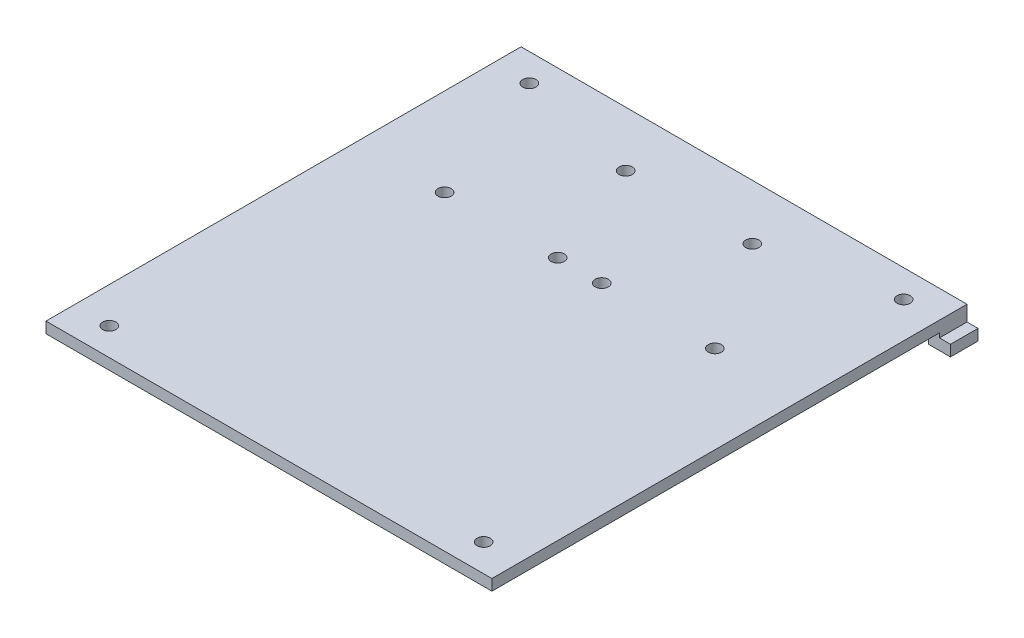
ISO-10303-21;
HEADER;
FILE_DESCRIPTION(('STEP AP214'),'2;1');
FILE_NAME('part.step','',(''),(''),'','','');
FILE_SCHEMA(('AUTOMOTIVE_DESIGN { 1 0 10303 214 1 1 1 1 }'));
ENDSEC;
DATA;
#1=APPLICATION_CONTEXT('core data for automotive mechanical design processes');
#2=APPLICATION_PROTOCOL_DEFINITION('international standard','automotive_design',2000,#1);
#3=PRODUCT_CONTEXT('',#1,'mechanical');
#4=PRODUCT('Part','Part','',(#3));
#5=PRODUCT_RELATED_PRODUCT_CATEGORY('part','',(#4));
#6=PRODUCT_DEFINITION_FORMATION('','',#4);
#7=PRODUCT_DEFINITION_CONTEXT('part definition',#1,'design');
#8=PRODUCT_DEFINITION('design','',#6,#7);
#9=PRODUCT_DEFINITION_SHAPE('','',#8);
#10=(LENGTH_UNIT() NAMED_UNIT(*) SI_UNIT(.MILLI.,.METRE.));
#11=(NAMED_UNIT(*) PLANE_ANGLE_UNIT() SI_UNIT($,.RADIAN.));
#12=(NAMED_UNIT(*) SI_UNIT($,.STERADIAN.) SOLID_ANGLE_UNIT());
#13=UNCERTAINTY_MEASURE_WITH_UNIT(LENGTH_MEASURE(1.E-05),#10,'distance_accuracy_value','');
#14=(GEOMETRIC_REPRESENTATION_CONTEXT(3) GLOBAL_UNCERTAINTY_ASSIGNED_CONTEXT((#13)) GLOBAL_UNIT_ASSIGNED_CONTEXT((#10,
#11,#12)) REPRESENTATION_CONTEXT('',''));
#15=CARTESIAN_POINT('',(0.,0.,0.));
#16=DIRECTION('',(0.,0.,1.));
#17=DIRECTION('',(1.,0.,0.));
#18=AXIS2_PLACEMENT_3D('',#15,#16,#17);
#19=CARTESIAN_POINT('',(0.,0.,0.));
#20=DIRECTION('',(0.,1.,0.));
#21=DIRECTION('',(0.,0.,1.));
#22=AXIS2_PLACEMENT_3D('',#19,#20,#21);
#23=PLANE('',#22);
#24=CARTESIAN_POINT('',(24.55,0.,-13.3));
#25=DIRECTION('',(0.,1.,0.));
#26=DIRECTION('',(0.,0.,1.));
#27=AXIS2_PLACEMENT_3D('',#24,#25,#26);
#28=CIRCLE('',#27,1.2);
#29=CARTESIAN_POINT('',(24.55,0.,-12.1));
#30=VERTEX_POINT('',#29);
#31=EDGE_CURVE('E237',#30,#30,#28,.T.);
#32=ORIENTED_EDGE('',*,*,#31,.T.);
#33=EDGE_LOOP('',(#32));
#34=FACE_BOUND('',#33,.T.);
#35=CARTESIAN_POINT('',(-11.5,0.,-33.15));
#36=DIRECTION('',(0.,1.,0.));
#37=DIRECTION('',(0.,0.,1.));
#38=AXIS2_PLACEMENT_3D('',#35,#36,#37);
#39=CIRCLE('',#38,1.2);
#40=CARTESIAN_POINT('',(-11.5,0.,-31.95));
#41=VERTEX_POINT('',#40);
#42=EDGE_CURVE('E244',#41,#41,#39,.T.);
#43=ORIENTED_EDGE('',*,*,#42,.T.);
#44=EDGE_LOOP('',(#43));
#45=FACE_BOUND('',#44,.T.);
#46=CARTESIAN_POINT('',(11.5,0.,-33.15));
#47=DIRECTION('',(0.,1.,0.));
#48=DIRECTION('',(0.,0.,1.));
#49=AXIS2_PLACEMENT_3D('',#46,#47,#48);
#50=CIRCLE('',#49,1.2);
#51=CARTESIAN_POINT('',(11.5,0.,-31.95));
#52=VERTEX_POINT('',#51);
#53=EDGE_CURVE('E225',#52,#52,#50,.T.);
#54=ORIENTED_EDGE('',*,*,#53,.T.);
#55=EDGE_LOOP('',(#54));
#56=FACE_BOUND('',#55,.T.);
#57=CARTESIAN_POINT('',(-4.,0.,-13.3));
#58=DIRECTION('',(0.,1.,0.));
#59=DIRECTION('',(0.,0.,1.));
#60=AXIS2_PLACEMENT_3D('',#57,#58,#59);
#61=CIRCLE('',#60,1.2);
#62=CARTESIAN_POINT('',(-4.,0.,-12.1));
#63=VERTEX_POINT('',#62);
#64=EDGE_CURVE('E232',#63,#63,#61,.T.);
#65=ORIENTED_EDGE('',*,*,#64,.T.);
#66=EDGE_LOOP('',(#65));
#67=FACE_BOUND('',#66,.T.);
#68=CARTESIAN_POINT('',(-24.55,0.,-13.3));
#69=DIRECTION('',(0.,1.,0.));
#70=DIRECTION('',(0.,0.,1.));
#71=AXIS2_PLACEMENT_3D('',#68,#69,#70);
#72=CIRCLE('',#71,1.2);
#73=CARTESIAN_POINT('',(-24.55,0.,-12.1));
#74=VERTEX_POINT('',#73);
#75=EDGE_CURVE('E268',#74,#74,#72,.T.);
#76=ORIENTED_EDGE('',*,*,#75,.T.);
#77=EDGE_LOOP('',(#76));
#78=FACE_BOUND('',#77,.T.);
#79=CARTESIAN_POINT('',(34.,0.,38.15));
#80=DIRECTION('',(0.,1.,0.));
#81=DIRECTION('',(0.,0.,1.));
#82=AXIS2_PLACEMENT_3D('',#79,#80,#81);
#83=CIRCLE('',#82,1.2);
#84=CARTESIAN_POINT('',(34.,0.,39.35));
#85=VERTEX_POINT('',#84);
#86=EDGE_CURVE('E262',#85,#85,#83,.T.);
#87=ORIENTED_EDGE('',*,*,#86,.T.);
#88=EDGE_LOOP('',(#87));
#89=FACE_BOUND('',#88,.T.);
#90=CARTESIAN_POINT('',(34.,0.,-38.15));
#91=DIRECTION('',(0.,1.,0.));
#92=DIRECTION('',(0.,0.,1.));
#93=AXIS2_PLACEMENT_3D('',#90,#91,#92);
#94=CIRCLE('',#93,1.2);
#95=CARTESIAN_POINT('',(34.,0.,-36.95));
#96=VERTEX_POINT('',#95);
#97=EDGE_CURVE('E256',#96,#96,#94,.T.);
#98=ORIENTED_EDGE('',*,*,#97,.T.);
#99=EDGE_LOOP('',(#98));
#100=FACE_BOUND('',#99,.T.);
#101=CARTESIAN_POINT('',(-34.,0.,-38.15));
#102=DIRECTION('',(0.,1.,0.));
#103=DIRECTION('',(0.,0.,1.));
#104=AXIS2_PLACEMENT_3D('',#101,#102,#103);
#105=CIRCLE('',#104,1.2);
#106=CARTESIAN_POINT('',(-34.,0.,-36.95));
#107=VERTEX_POINT('',#106);
#108=EDGE_CURVE('E249',#107,#107,#105,.T.);
#109=ORIENTED_EDGE('',*,*,#108,.T.);
#110=EDGE_LOOP('',(#109));
#111=FACE_BOUND('',#110,.T.);
#112=CARTESIAN_POINT('',(4.,0.,-13.3));
#113=DIRECTION('',(0.,1.,0.));
#114=DIRECTION('',(0.,0.,1.));
#115=AXIS2_PLACEMENT_3D('',#112,#113,#114);
#116=CIRCLE('',#115,1.2);
#117=CARTESIAN_POINT('',(4.,0.,-12.1));
#118=VERTEX_POINT('',#117);
#119=EDGE_CURVE('E219',#118,#118,#116,.T.);
#120=ORIENTED_EDGE('',*,*,#119,.T.);
#121=EDGE_LOOP('',(#120));
#122=FACE_BOUND('',#121,.T.);
#123=CARTESIAN_POINT('',(-34.,0.,38.15));
#124=DIRECTION('',(0.,1.,0.));
#125=DIRECTION('',(0.,0.,1.));
#126=AXIS2_PLACEMENT_3D('',#123,#124,#125);
#127=CIRCLE('',#126,1.2);
#128=CARTESIAN_POINT('',(-34.,0.,39.35));
#129=VERTEX_POINT('',#128);
#130=EDGE_CURVE('E273',#129,#129,#127,.T.);
#131=ORIENTED_EDGE('',*,*,#130,.T.);
#132=EDGE_LOOP('',(#131));
#133=FACE_BOUND('',#132,.T.);
#134=DIRECTION('',(-1.,0.,0.));
#135=VECTOR('',#134,1.);
#136=CARTESIAN_POINT('',(38.5,0.,-38.15));
#137=LINE('',#136,#135);
#138=CARTESIAN_POINT('',(40.5,0.,-38.15));
#139=VERTEX_POINT('',#138);
#140=CARTESIAN_POINT('',(38.5,0.,-38.15));
#141=VERTEX_POINT('',#140);
#142=EDGE_CURVE('E192',#139,#141,#137,.T.);
#143=ORIENTED_EDGE('',*,*,#142,.F.);
#144=DIRECTION('',(0.,0.,-1.));
#145=VECTOR('',#144,1.);
#146=CARTESIAN_POINT('',(40.5,0.,43.15));
#147=LINE('',#146,#145);
#148=CARTESIAN_POINT('',(40.5,0.,43.15));
#149=VERTEX_POINT('',#148);
#150=EDGE_CURVE('E292',#149,#139,#147,.T.);
#151=ORIENTED_EDGE('',*,*,#150,.F.);
#152=DIRECTION('',(1.,0.,0.));
#153=VECTOR('',#152,1.);
#154=CARTESIAN_POINT('',(40.5,0.,43.15));
#155=LINE('',#154,#153);
#156=CARTESIAN_POINT('',(-40.5,0.,43.15));
#157=VERTEX_POINT('',#156);
#158=EDGE_CURVE('E290',#157,#149,#155,.T.);
#159=ORIENTED_EDGE('',*,*,#158,.F.);
#160=DIRECTION('',(0.,0.,1.));
#161=VECTOR('',#160,1.);
#162=CARTESIAN_POINT('',(-40.5,0.,43.15));
#163=LINE('',#162,#161);
#164=CARTESIAN_POINT('',(-40.5,0.,-38.15));
#165=VERTEX_POINT('',#164);
#166=EDGE_CURVE('E276',#165,#157,#163,.T.);
#167=ORIENTED_EDGE('',*,*,#166,.F.);
#168=DIRECTION('',(-1.,0.,0.));
#169=VECTOR('',#168,1.);
#170=CARTESIAN_POINT('',(-38.5,0.,-38.15));
#171=LINE('',#170,#169);
#172=CARTESIAN_POINT('',(-38.5,0.,-38.15));
#173=VERTEX_POINT('',#172);
#174=EDGE_CURVE('E205',#173,#165,#171,.T.);
#175=ORIENTED_EDGE('',*,*,#174,.F.);
#176=DIRECTION('',(0.,0.,1.));
#177=VECTOR('',#176,1.);
#178=CARTESIAN_POINT('',(-38.5,0.,-38.15));
#179=LINE('',#178,#177);
#180=CARTESIAN_POINT('',(-38.5,0.,-43.15));
#181=VERTEX_POINT('',#180);
#182=EDGE_CURVE('E200',#181,#173,#179,.T.);
#183=ORIENTED_EDGE('',*,*,#182,.F.);
#184=DIRECTION('',(-1.,0.,0.));
#185=VECTOR('',#184,1.);
#186=CARTESIAN_POINT('',(40.5,0.,-43.15));
#187=LINE('',#186,#185);
#188=CARTESIAN_POINT('',(38.5,0.,-43.15));
#189=VERTEX_POINT('',#188);
#190=EDGE_CURVE('E53',#189,#181,#187,.T.);
#191=ORIENTED_EDGE('',*,*,#190,.F.);
#192=DIRECTION('',(0.,0.,-1.));
#193=VECTOR('',#192,1.);
#194=CARTESIAN_POINT('',(38.5,0.,-38.15));
#195=LINE('',#194,#193);
#196=EDGE_CURVE('E137',#141,#189,#195,.T.);
#197=ORIENTED_EDGE('',*,*,#196,.F.);
#198=EDGE_LOOP('',(#143,#151,#159,#167,#175,#183,#191,#197));
#199=FACE_BOUND('',#198,.T.);
#200=ADVANCED_FACE('F33',(#34,#45,#56,#67,#78,#89,#100,#111,#122,#133,#199),#23,.F.);
#201=CARTESIAN_POINT('',(-40.5,2.,43.15));
#202=DIRECTION('',(1.,0.,0.));
#203=DIRECTION('',(0.,0.,-1.));
#204=AXIS2_PLACEMENT_3D('',#201,#202,#203);
#205=PLANE('',#204);
#206=DIRECTION('',(0.,-1.,0.));
#207=VECTOR('',#206,1.);
#208=CARTESIAN_POINT('',(-40.5,2.,-43.15));
#209=LINE('',#208,#207);
#210=CARTESIAN_POINT('',(-40.5,2.,-43.15));
#211=VERTEX_POINT('',#210);
#212=CARTESIAN_POINT('',(-40.5,-0.8,-43.15));
#213=VERTEX_POINT('',#212);
#214=EDGE_CURVE('E288',#211,#213,#209,.T.);
#215=ORIENTED_EDGE('',*,*,#214,.T.);
#216=DIRECTION('',(0.,0.,-1.));
#217=VECTOR('',#216,1.);
#218=CARTESIAN_POINT('',(-40.5,-0.8,-38.15));
#219=LINE('',#218,#217);
#220=CARTESIAN_POINT('',(-40.5,-0.8,-38.15));
#221=VERTEX_POINT('',#220);
#222=EDGE_CURVE('E201',#221,#213,#219,.T.);
#223=ORIENTED_EDGE('',*,*,#222,.F.);
#224=DIRECTION('',(0.,1.,0.));
#225=VECTOR('',#224,1.);
#226=CARTESIAN_POINT('',(-40.5,-0.8,-38.15));
#227=LINE('',#226,#225);
#228=EDGE_CURVE('E204',#221,#165,#227,.T.);
#229=ORIENTED_EDGE('',*,*,#228,.T.);
#230=ORIENTED_EDGE('',*,*,#166,.T.);
#231=DIRECTION('',(0.,-1.,0.));
#232=VECTOR('',#231,1.);
#233=CARTESIAN_POINT('',(-40.5,2.,43.15));
#234=LINE('',#233,#232);
#235=CARTESIAN_POINT('',(-40.5,2.,43.15));
#236=VERTEX_POINT('',#235);
#237=EDGE_CURVE('E11',#236,#157,#234,.T.);
#238=ORIENTED_EDGE('',*,*,#237,.F.);
#239=DIRECTION('',(0.,0.,1.));
#240=VECTOR('',#239,1.);
#241=CARTESIAN_POINT('',(-40.5,2.,43.15));
#242=LINE('',#241,#240);
#243=EDGE_CURVE('E279',#211,#236,#242,.T.);
#244=ORIENTED_EDGE('',*,*,#243,.F.);
#245=EDGE_LOOP('',(#215,#223,#229,#230,#238,#244));
#246=FACE_BOUND('',#245,.T.);
#247=ADVANCED_FACE('F35',(#246),#205,.F.);
#248=CARTESIAN_POINT('',(40.5,2.,43.15));
#249=DIRECTION('',(0.,0.,-1.));
#250=DIRECTION('',(-1.,0.,0.));
#251=AXIS2_PLACEMENT_3D('',#248,#249,#250);
#252=PLANE('',#251);
#253=ORIENTED_EDGE('',*,*,#158,.T.);
#254=DIRECTION('',(0.,-1.,0.));
#255=VECTOR('',#254,1.);
#256=CARTESIAN_POINT('',(40.5,2.,43.15));
#257=LINE('',#256,#255);
#258=CARTESIAN_POINT('',(40.5,2.,43.15));
#259=VERTEX_POINT('',#258);
#260=EDGE_CURVE('E41',#259,#149,#257,.T.);
#261=ORIENTED_EDGE('',*,*,#260,.F.);
#262=DIRECTION('',(1.,0.,0.));
#263=VECTOR('',#262,1.);
#264=CARTESIAN_POINT('',(40.5,2.,43.15));
#265=LINE('',#264,#263);
#266=EDGE_CURVE('E282',#236,#259,#265,.T.);
#267=ORIENTED_EDGE('',*,*,#266,.F.);
#268=ORIENTED_EDGE('',*,*,#237,.T.);
#269=EDGE_LOOP('',(#253,#261,#267,#268));
#270=FACE_BOUND('',#269,.T.);
#271=ADVANCED_FACE('F337',(#270),#252,.F.);
#272=CARTESIAN_POINT('',(40.5,2.,43.15));
#273=DIRECTION('',(-1.,0.,0.));
#274=DIRECTION('',(0.,0.,1.));
#275=AXIS2_PLACEMENT_3D('',#272,#273,#274);
#276=PLANE('',#275);
#277=ORIENTED_EDGE('',*,*,#150,.T.);
#278=DIRECTION('',(0.,1.,0.));
#279=VECTOR('',#278,1.);
#280=CARTESIAN_POINT('',(40.5,-0.8,-38.15));
#281=LINE('',#280,#279);
#282=CARTESIAN_POINT('',(40.5,-0.8,-38.15));
#283=VERTEX_POINT('',#282);
#284=EDGE_CURVE('E198',#283,#139,#281,.T.);
#285=ORIENTED_EDGE('',*,*,#284,.F.);
#286=DIRECTION('',(0.,0.,1.));
#287=VECTOR('',#286,1.);
#288=CARTESIAN_POINT('',(40.5,-0.8,-38.15));
#289=LINE('',#288,#287);
#290=CARTESIAN_POINT('',(40.5,-0.8,-43.15));
#291=VERTEX_POINT('',#290);
#292=EDGE_CURVE('E139',#291,#283,#289,.T.);
#293=ORIENTED_EDGE('',*,*,#292,.F.);
#294=DIRECTION('',(0.,-1.,0.));
#295=VECTOR('',#294,1.);
#296=CARTESIAN_POINT('',(40.5,2.,-43.15));
#297=LINE('',#296,#295);
#298=CARTESIAN_POINT('',(40.5,2.,-43.15));
#299=VERTEX_POINT('',#298);
#300=EDGE_CURVE('E297',#299,#291,#297,.T.);
#301=ORIENTED_EDGE('',*,*,#300,.F.);
#302=DIRECTION('',(0.,0.,-1.));
#303=VECTOR('',#302,1.);
#304=CARTESIAN_POINT('',(40.5,2.,43.15));
#305=LINE('',#304,#303);
#306=EDGE_CURVE('E284',#259,#299,#305,.T.);
#307=ORIENTED_EDGE('',*,*,#306,.F.);
#308=ORIENTED_EDGE('',*,*,#260,.T.);
#309=EDGE_LOOP('',(#277,#285,#293,#301,#307,#308));
#310=FACE_BOUND('',#309,.T.);
#311=ADVANCED_FACE('F303',(#310),#276,.F.);
#312=CARTESIAN_POINT('',(40.5,2.,-43.15));
#313=DIRECTION('',(0.,0.,1.));
#314=DIRECTION('',(1.,0.,0.));
#315=AXIS2_PLACEMENT_3D('',#312,#313,#314);
#316=PLANE('',#315);
#317=ORIENTED_EDGE('',*,*,#300,.T.);
#318=DIRECTION('',(1.,0.,0.));
#319=VECTOR('',#318,1.);
#320=CARTESIAN_POINT('',(42.5,-0.8,-43.15));
#321=LINE('',#320,#319);
#322=CARTESIAN_POINT('',(42.5,-0.8,-43.15));
#323=VERTEX_POINT('',#322);
#324=EDGE_CURVE('E163',#291,#323,#321,.T.);
#325=ORIENTED_EDGE('',*,*,#324,.T.);
#326=DIRECTION('',(0.,1.,0.));
#327=VECTOR('',#326,1.);
#328=CARTESIAN_POINT('',(42.5,-2.8,-43.15));
#329=LINE('',#328,#327);
#330=CARTESIAN_POINT('',(42.5,-2.8,-43.15));
#331=VERTEX_POINT('',#330);
#332=EDGE_CURVE('E145',#331,#323,#329,.T.);
#333=ORIENTED_EDGE('',*,*,#332,.F.);
#334=DIRECTION('',(1.,0.,0.));
#335=VECTOR('',#334,1.);
#336=CARTESIAN_POINT('',(42.5,-2.8,-43.15));
#337=LINE('',#336,#335);
#338=CARTESIAN_POINT('',(38.5,-2.8,-43.15));
#339=VERTEX_POINT('',#338);
#340=EDGE_CURVE('E142',#339,#331,#337,.T.);
#341=ORIENTED_EDGE('',*,*,#340,.F.);
#342=DIRECTION('',(0.,1.,0.));
#343=VECTOR('',#342,1.);
#344=CARTESIAN_POINT('',(38.5,-0.8,-43.15));
#345=LINE('',#344,#343);
#346=EDGE_CURVE('E48',#339,#189,#345,.T.);
#347=ORIENTED_EDGE('',*,*,#346,.T.);
#348=ORIENTED_EDGE('',*,*,#190,.T.);
#349=DIRECTION('',(0.,1.,0.));
#350=VECTOR('',#349,1.);
#351=CARTESIAN_POINT('',(-38.5,-0.8,-43.15));
#352=LINE('',#351,#350);
#353=CARTESIAN_POINT('',(-38.5,-2.8,-43.15));
#354=VERTEX_POINT('',#353);
#355=EDGE_CURVE('E215',#354,#181,#352,.T.);
#356=ORIENTED_EDGE('',*,*,#355,.F.);
#357=DIRECTION('',(1.,0.,0.));
#358=VECTOR('',#357,1.);
#359=CARTESIAN_POINT('',(-42.5,-2.8,-43.15));
#360=LINE('',#359,#358);
#361=CARTESIAN_POINT('',(-42.5,-2.8,-43.15));
#362=VERTEX_POINT('',#361);
#363=EDGE_CURVE('E178',#362,#354,#360,.T.);
#364=ORIENTED_EDGE('',*,*,#363,.F.);
#365=DIRECTION('',(0.,1.,0.));
#366=VECTOR('',#365,1.);
#367=CARTESIAN_POINT('',(-42.5,-2.8,-43.15));
#368=LINE('',#367,#366);
#369=CARTESIAN_POINT('',(-42.5,-0.8,-43.15));
#370=VERTEX_POINT('',#369);
#371=EDGE_CURVE('E181',#362,#370,#368,.T.);
#372=ORIENTED_EDGE('',*,*,#371,.T.);
#373=DIRECTION('',(1.,0.,0.));
#374=VECTOR('',#373,1.);
#375=CARTESIAN_POINT('',(-42.5,-0.8,-43.15));
#376=LINE('',#375,#374);
#377=EDGE_CURVE('E174',#370,#213,#376,.T.);
#378=ORIENTED_EDGE('',*,*,#377,.T.);
#379=ORIENTED_EDGE('',*,*,#214,.F.);
#380=DIRECTION('',(-1.,0.,0.));
#381=VECTOR('',#380,1.);
#382=CARTESIAN_POINT('',(40.5,2.,-43.15));
#383=LINE('',#382,#381);
#384=EDGE_CURVE('E286',#299,#211,#383,.T.);
#385=ORIENTED_EDGE('',*,*,#384,.F.);
#386=EDGE_LOOP('',(#317,#325,#333,#341,#347,#348,#356,#364,#372,#378,#379,#385));
#387=FACE_BOUND('',#386,.T.);
#388=ADVANCED_FACE('F143',(#387),#316,.F.);
#389=CARTESIAN_POINT('',(0.,2.,0.));
#390=DIRECTION('',(0.,1.,0.));
#391=DIRECTION('',(0.,0.,1.));
#392=AXIS2_PLACEMENT_3D('',#389,#390,#391);
#393=PLANE('',#392);
#394=CARTESIAN_POINT('',(24.55,2.,-13.3));
#395=DIRECTION('',(0.,1.,0.));
#396=DIRECTION('',(0.,0.,1.));
#397=AXIS2_PLACEMENT_3D('',#394,#395,#396);
#398=CIRCLE('',#397,1.2);
#399=CARTESIAN_POINT('',(24.55,2.,-12.1));
#400=VERTEX_POINT('',#399);
#401=EDGE_CURVE('E241',#400,#400,#398,.T.);
#402=ORIENTED_EDGE('',*,*,#401,.F.);
#403=EDGE_LOOP('',(#402));
#404=FACE_BOUND('',#403,.T.);
#405=CARTESIAN_POINT('',(-11.5,2.,-33.15));
#406=DIRECTION('',(0.,1.,0.));
#407=DIRECTION('',(0.,0.,1.));
#408=AXIS2_PLACEMENT_3D('',#405,#406,#407);
#409=CIRCLE('',#408,1.2);
#410=CARTESIAN_POINT('',(-11.5,2.,-31.95));
#411=VERTEX_POINT('',#410);
#412=EDGE_CURVE('E228',#411,#411,#409,.T.);
#413=ORIENTED_EDGE('',*,*,#412,.F.);
#414=EDGE_LOOP('',(#413));
#415=FACE_BOUND('',#414,.T.);
#416=CARTESIAN_POINT('',(11.5,2.,-33.15));
#417=DIRECTION('',(0.,1.,0.));
#418=DIRECTION('',(0.,0.,1.));
#419=AXIS2_PLACEMENT_3D('',#416,#417,#418);
#420=CIRCLE('',#419,1.2);
#421=CARTESIAN_POINT('',(11.5,2.,-31.95));
#422=VERTEX_POINT('',#421);
#423=EDGE_CURVE('E229',#422,#422,#420,.T.);
#424=ORIENTED_EDGE('',*,*,#423,.F.);
#425=EDGE_LOOP('',(#424));
#426=FACE_BOUND('',#425,.T.);
#427=CARTESIAN_POINT('',(-4.,2.,-13.3));
#428=DIRECTION('',(0.,1.,0.));
#429=DIRECTION('',(0.,0.,1.));
#430=AXIS2_PLACEMENT_3D('',#427,#428,#429);
#431=CIRCLE('',#430,1.2);
#432=CARTESIAN_POINT('',(-4.,2.,-12.1));
#433=VERTEX_POINT('',#432);
#434=EDGE_CURVE('E222',#433,#433,#431,.T.);
#435=ORIENTED_EDGE('',*,*,#434,.F.);
#436=EDGE_LOOP('',(#435));
#437=FACE_BOUND('',#436,.T.);
#438=CARTESIAN_POINT('',(-24.55,2.,-13.3));
#439=DIRECTION('',(0.,1.,0.));
#440=DIRECTION('',(0.,0.,1.));
#441=AXIS2_PLACEMENT_3D('',#438,#439,#440);
#442=CIRCLE('',#441,1.2);
#443=CARTESIAN_POINT('',(-24.55,2.,-12.1));
#444=VERTEX_POINT('',#443);
#445=EDGE_CURVE('E240',#444,#444,#442,.T.);
#446=ORIENTED_EDGE('',*,*,#445,.F.);
#447=EDGE_LOOP('',(#446));
#448=FACE_BOUND('',#447,.T.);
#449=CARTESIAN_POINT('',(34.,2.,38.15));
#450=DIRECTION('',(0.,1.,0.));
#451=DIRECTION('',(0.,0.,1.));
#452=AXIS2_PLACEMENT_3D('',#449,#450,#451);
#453=CIRCLE('',#452,1.2);
#454=CARTESIAN_POINT('',(34.,2.,39.35));
#455=VERTEX_POINT('',#454);
#456=EDGE_CURVE('E265',#455,#455,#453,.T.);
#457=ORIENTED_EDGE('',*,*,#456,.F.);
#458=EDGE_LOOP('',(#457));
#459=FACE_BOUND('',#458,.T.);
#460=CARTESIAN_POINT('',(34.,2.,-38.15));
#461=DIRECTION('',(0.,1.,0.));
#462=DIRECTION('',(0.,0.,1.));
#463=AXIS2_PLACEMENT_3D('',#460,#461,#462);
#464=CIRCLE('',#463,1.2);
#465=CARTESIAN_POINT('',(34.,2.,-36.95));
#466=VERTEX_POINT('',#465);
#467=EDGE_CURVE('E259',#466,#466,#464,.T.);
#468=ORIENTED_EDGE('',*,*,#467,.F.);
#469=EDGE_LOOP('',(#468));
#470=FACE_BOUND('',#469,.T.);
#471=CARTESIAN_POINT('',(-34.,2.,-38.15));
#472=DIRECTION('',(0.,1.,0.));
#473=DIRECTION('',(0.,0.,1.));
#474=AXIS2_PLACEMENT_3D('',#471,#472,#473);
#475=CIRCLE('',#474,1.2);
#476=CARTESIAN_POINT('',(-34.,2.,-36.95));
#477=VERTEX_POINT('',#476);
#478=EDGE_CURVE('E253',#477,#477,#475,.T.);
#479=ORIENTED_EDGE('',*,*,#478,.F.);
#480=EDGE_LOOP('',(#479));
#481=FACE_BOUND('',#480,.T.);
#482=CARTESIAN_POINT('',(4.,2.,-13.3));
#483=DIRECTION('',(0.,1.,0.));
#484=DIRECTION('',(0.,0.,1.));
#485=AXIS2_PLACEMENT_3D('',#482,#483,#484);
#486=CIRCLE('',#485,1.2);
#487=CARTESIAN_POINT('',(4.,2.,-12.1));
#488=VERTEX_POINT('',#487);
#489=EDGE_CURVE('E218',#488,#488,#486,.T.);
#490=ORIENTED_EDGE('',*,*,#489,.F.);
#491=EDGE_LOOP('',(#490));
#492=FACE_BOUND('',#491,.T.);
#493=CARTESIAN_POINT('',(-34.,2.,38.15));
#494=DIRECTION('',(0.,1.,0.));
#495=DIRECTION('',(0.,0.,1.));
#496=AXIS2_PLACEMENT_3D('',#493,#494,#495);
#497=CIRCLE('',#496,1.2);
#498=CARTESIAN_POINT('',(-34.,2.,39.35));
#499=VERTEX_POINT('',#498);
#500=EDGE_CURVE('E252',#499,#499,#497,.T.);
#501=ORIENTED_EDGE('',*,*,#500,.F.);
#502=EDGE_LOOP('',(#501));
#503=FACE_BOUND('',#502,.T.);
#504=ORIENTED_EDGE('',*,*,#243,.T.);
#505=ORIENTED_EDGE('',*,*,#266,.T.);
#506=ORIENTED_EDGE('',*,*,#306,.T.);
#507=ORIENTED_EDGE('',*,*,#384,.T.);
#508=EDGE_LOOP('',(#504,#505,#506,#507));
#509=FACE_BOUND('',#508,.T.);
#510=ADVANCED_FACE('F342',(#404,#415,#426,#437,#448,#459,#470,#481,#492,#503,#509),#393,.T.);
#511=CARTESIAN_POINT('',(-34.,0.,38.15));
#512=DIRECTION('',(0.,1.,0.));
#513=DIRECTION('',(0.,0.,1.));
#514=AXIS2_PLACEMENT_3D('',#511,#512,#513);
#515=CYLINDRICAL_SURFACE('',#514,1.2);
#516=ORIENTED_EDGE('',*,*,#130,.F.);
#517=EDGE_LOOP('',(#516));
#518=FACE_BOUND('',#517,.T.);
#519=ORIENTED_EDGE('',*,*,#500,.T.);
#520=EDGE_LOOP('',(#519));
#521=FACE_BOUND('',#520,.T.);
#522=ADVANCED_FACE('F374',(#518,#521),#515,.F.);
#523=CARTESIAN_POINT('',(4.,0.,-13.3));
#524=DIRECTION('',(0.,1.,0.));
#525=DIRECTION('',(0.,0.,1.));
#526=AXIS2_PLACEMENT_3D('',#523,#524,#525);
#527=CYLINDRICAL_SURFACE('',#526,1.2);
#528=ORIENTED_EDGE('',*,*,#119,.F.);
#529=EDGE_LOOP('',(#528));
#530=FACE_BOUND('',#529,.T.);
#531=ORIENTED_EDGE('',*,*,#489,.T.);
#532=EDGE_LOOP('',(#531));
#533=FACE_BOUND('',#532,.T.);
#534=ADVANCED_FACE('F379',(#530,#533),#527,.F.);
#535=CARTESIAN_POINT('',(-34.,0.,-38.15));
#536=DIRECTION('',(0.,1.,0.));
#537=DIRECTION('',(0.,0.,1.));
#538=AXIS2_PLACEMENT_3D('',#535,#536,#537);
#539=CYLINDRICAL_SURFACE('',#538,1.2);
#540=ORIENTED_EDGE('',*,*,#108,.F.);
#541=EDGE_LOOP('',(#540));
#542=FACE_BOUND('',#541,.T.);
#543=ORIENTED_EDGE('',*,*,#478,.T.);
#544=EDGE_LOOP('',(#543));
#545=FACE_BOUND('',#544,.T.);
#546=ADVANCED_FACE('F403',(#542,#545),#539,.F.);
#547=CARTESIAN_POINT('',(34.,0.,-38.15));
#548=DIRECTION('',(0.,1.,0.));
#549=DIRECTION('',(0.,0.,1.));
#550=AXIS2_PLACEMENT_3D('',#547,#548,#549);
#551=CYLINDRICAL_SURFACE('',#550,1.2);
#552=ORIENTED_EDGE('',*,*,#97,.F.);
#553=EDGE_LOOP('',(#552));
#554=FACE_BOUND('',#553,.T.);
#555=ORIENTED_EDGE('',*,*,#467,.T.);
#556=EDGE_LOOP('',(#555));
#557=FACE_BOUND('',#556,.T.);
#558=ADVANCED_FACE('F409',(#554,#557),#551,.F.);
#559=CARTESIAN_POINT('',(34.,0.,38.15));
#560=DIRECTION('',(0.,1.,0.));
#561=DIRECTION('',(0.,0.,1.));
#562=AXIS2_PLACEMENT_3D('',#559,#560,#561);
#563=CYLINDRICAL_SURFACE('',#562,1.2);
#564=ORIENTED_EDGE('',*,*,#86,.F.);
#565=EDGE_LOOP('',(#564));
#566=FACE_BOUND('',#565,.T.);
#567=ORIENTED_EDGE('',*,*,#456,.T.);
#568=EDGE_LOOP('',(#567));
#569=FACE_BOUND('',#568,.T.);
#570=ADVANCED_FACE('F435',(#566,#569),#563,.F.);
#571=CARTESIAN_POINT('',(-24.55,0.,-13.3));
#572=DIRECTION('',(0.,1.,0.));
#573=DIRECTION('',(0.,0.,1.));
#574=AXIS2_PLACEMENT_3D('',#571,#572,#573);
#575=CYLINDRICAL_SURFACE('',#574,1.2);
#576=ORIENTED_EDGE('',*,*,#75,.F.);
#577=EDGE_LOOP('',(#576));
#578=FACE_BOUND('',#577,.T.);
#579=ORIENTED_EDGE('',*,*,#445,.T.);
#580=EDGE_LOOP('',(#579));
#581=FACE_BOUND('',#580,.T.);
#582=ADVANCED_FACE('F424',(#578,#581),#575,.F.);
#583=CARTESIAN_POINT('',(-4.,0.,-13.3));
#584=DIRECTION('',(0.,1.,0.));
#585=DIRECTION('',(0.,0.,1.));
#586=AXIS2_PLACEMENT_3D('',#583,#584,#585);
#587=CYLINDRICAL_SURFACE('',#586,1.2);
#588=ORIENTED_EDGE('',*,*,#64,.F.);
#589=EDGE_LOOP('',(#588));
#590=FACE_BOUND('',#589,.T.);
#591=ORIENTED_EDGE('',*,*,#434,.T.);
#592=EDGE_LOOP('',(#591));
#593=FACE_BOUND('',#592,.T.);
#594=ADVANCED_FACE('F420',(#590,#593),#587,.F.);
#595=CARTESIAN_POINT('',(11.5,0.,-33.15));
#596=DIRECTION('',(0.,1.,0.));
#597=DIRECTION('',(0.,0.,1.));
#598=AXIS2_PLACEMENT_3D('',#595,#596,#597);
#599=CYLINDRICAL_SURFACE('',#598,1.2);
#600=ORIENTED_EDGE('',*,*,#53,.F.);
#601=EDGE_LOOP('',(#600));
#602=FACE_BOUND('',#601,.T.);
#603=ORIENTED_EDGE('',*,*,#423,.T.);
#604=EDGE_LOOP('',(#603));
#605=FACE_BOUND('',#604,.T.);
#606=ADVANCED_FACE('F416',(#602,#605),#599,.F.);
#607=CARTESIAN_POINT('',(-11.5,0.,-33.15));
#608=DIRECTION('',(0.,1.,0.));
#609=DIRECTION('',(0.,0.,1.));
#610=AXIS2_PLACEMENT_3D('',#607,#608,#609);
#611=CYLINDRICAL_SURFACE('',#610,1.2);
#612=ORIENTED_EDGE('',*,*,#42,.F.);
#613=EDGE_LOOP('',(#612));
#614=FACE_BOUND('',#613,.T.);
#615=ORIENTED_EDGE('',*,*,#412,.T.);
#616=EDGE_LOOP('',(#615));
#617=FACE_BOUND('',#616,.T.);
#618=ADVANCED_FACE('F419',(#614,#617),#611,.F.);
#619=CARTESIAN_POINT('',(24.55,0.,-13.3));
#620=DIRECTION('',(0.,1.,0.));
#621=DIRECTION('',(0.,0.,1.));
#622=AXIS2_PLACEMENT_3D('',#619,#620,#621);
#623=CYLINDRICAL_SURFACE('',#622,1.2);
#624=ORIENTED_EDGE('',*,*,#31,.F.);
#625=EDGE_LOOP('',(#624));
#626=FACE_BOUND('',#625,.T.);
#627=ORIENTED_EDGE('',*,*,#401,.T.);
#628=EDGE_LOOP('',(#627));
#629=FACE_BOUND('',#628,.T.);
#630=ADVANCED_FACE('F426',(#626,#629),#623,.F.);
#631=CARTESIAN_POINT('',(-38.5,-0.8,-38.15));
#632=DIRECTION('',(-1.,0.,0.));
#633=DIRECTION('',(0.,0.,1.));
#634=AXIS2_PLACEMENT_3D('',#631,#632,#633);
#635=PLANE('',#634);
#636=ORIENTED_EDGE('',*,*,#182,.T.);
#637=DIRECTION('',(0.,1.,0.));
#638=VECTOR('',#637,1.);
#639=CARTESIAN_POINT('',(-38.5,-0.8,-38.15));
#640=LINE('',#639,#638);
#641=CARTESIAN_POINT('',(-38.5,-2.8,-38.15));
#642=VERTEX_POINT('',#641);
#643=EDGE_CURVE('E212',#642,#173,#640,.T.);
#644=ORIENTED_EDGE('',*,*,#643,.F.);
#645=DIRECTION('',(0.,0.,1.));
#646=VECTOR('',#645,1.);
#647=CARTESIAN_POINT('',(-38.5,-2.8,-38.15));
#648=LINE('',#647,#646);
#649=EDGE_CURVE('E170',#354,#642,#648,.T.);
#650=ORIENTED_EDGE('',*,*,#649,.F.);
#651=ORIENTED_EDGE('',*,*,#355,.T.);
#652=EDGE_LOOP('',(#636,#644,#650,#651));
#653=FACE_BOUND('',#652,.T.);
#654=ADVANCED_FACE('F359',(#653),#635,.F.);
#655=CARTESIAN_POINT('',(-38.5,-0.8,-38.15));
#656=DIRECTION('',(0.,0.,-1.));
#657=DIRECTION('',(-1.,0.,0.));
#658=AXIS2_PLACEMENT_3D('',#655,#656,#657);
#659=PLANE('',#658);
#660=ORIENTED_EDGE('',*,*,#174,.T.);
#661=ORIENTED_EDGE('',*,*,#228,.F.);
#662=DIRECTION('',(-1.,0.,0.));
#663=VECTOR('',#662,1.);
#664=CARTESIAN_POINT('',(-42.5,-0.8,-38.15));
#665=LINE('',#664,#663);
#666=CARTESIAN_POINT('',(-42.5,-0.8,-38.15));
#667=VERTEX_POINT('',#666);
#668=EDGE_CURVE('E169',#221,#667,#665,.T.);
#669=ORIENTED_EDGE('',*,*,#668,.T.);
#670=DIRECTION('',(0.,1.,0.));
#671=VECTOR('',#670,1.);
#672=CARTESIAN_POINT('',(-42.5,-2.8,-38.15));
#673=LINE('',#672,#671);
#674=CARTESIAN_POINT('',(-42.5,-2.8,-38.15));
#675=VERTEX_POINT('',#674);
#676=EDGE_CURVE('E189',#675,#667,#673,.T.);
#677=ORIENTED_EDGE('',*,*,#676,.F.);
#678=DIRECTION('',(-1.,0.,0.));
#679=VECTOR('',#678,1.);
#680=CARTESIAN_POINT('',(-42.5,-2.8,-38.15));
#681=LINE('',#680,#679);
#682=EDGE_CURVE('E173',#642,#675,#681,.T.);
#683=ORIENTED_EDGE('',*,*,#682,.F.);
#684=ORIENTED_EDGE('',*,*,#643,.T.);
#685=EDGE_LOOP('',(#660,#661,#669,#677,#683,#684));
#686=FACE_BOUND('',#685,.T.);
#687=ADVANCED_FACE('F354',(#686),#659,.F.);
#688=CARTESIAN_POINT('',(38.5,-0.8,-38.15));
#689=DIRECTION('',(0.,0.,-1.));
#690=DIRECTION('',(-1.,0.,0.));
#691=AXIS2_PLACEMENT_3D('',#688,#689,#690);
#692=PLANE('',#691);
#693=ORIENTED_EDGE('',*,*,#142,.T.);
#694=DIRECTION('',(0.,1.,0.));
#695=VECTOR('',#694,1.);
#696=CARTESIAN_POINT('',(38.5,-0.8,-38.15));
#697=LINE('',#696,#695);
#698=CARTESIAN_POINT('',(38.5,-2.8,-38.15));
#699=VERTEX_POINT('',#698);
#700=EDGE_CURVE('E138',#699,#141,#697,.T.);
#701=ORIENTED_EDGE('',*,*,#700,.F.);
#702=DIRECTION('',(-1.,0.,0.));
#703=VECTOR('',#702,1.);
#704=CARTESIAN_POINT('',(42.5,-2.8,-38.15));
#705=LINE('',#704,#703);
#706=CARTESIAN_POINT('',(42.5,-2.8,-38.15));
#707=VERTEX_POINT('',#706);
#708=EDGE_CURVE('E153',#707,#699,#705,.T.);
#709=ORIENTED_EDGE('',*,*,#708,.F.);
#710=DIRECTION('',(0.,1.,0.));
#711=VECTOR('',#710,1.);
#712=CARTESIAN_POINT('',(42.5,-2.8,-38.15));
#713=LINE('',#712,#711);
#714=CARTESIAN_POINT('',(42.5,-0.8,-38.15));
#715=VERTEX_POINT('',#714);
#716=EDGE_CURVE('E162',#707,#715,#713,.T.);
#717=ORIENTED_EDGE('',*,*,#716,.T.);
#718=DIRECTION('',(-1.,0.,0.));
#719=VECTOR('',#718,1.);
#720=CARTESIAN_POINT('',(42.5,-0.8,-38.15));
#721=LINE('',#720,#719);
#722=EDGE_CURVE('E154',#715,#283,#721,.T.);
#723=ORIENTED_EDGE('',*,*,#722,.T.);
#724=ORIENTED_EDGE('',*,*,#284,.T.);
#725=EDGE_LOOP('',(#693,#701,#709,#717,#723,#724));
#726=FACE_BOUND('',#725,.T.);
#727=ADVANCED_FACE('F310',(#726),#692,.F.);
#728=CARTESIAN_POINT('',(38.5,-0.8,-38.15));
#729=DIRECTION('',(1.,0.,0.));
#730=DIRECTION('',(0.,0.,-1.));
#731=AXIS2_PLACEMENT_3D('',#728,#729,#730);
#732=PLANE('',#731);
#733=ORIENTED_EDGE('',*,*,#196,.T.);
#734=ORIENTED_EDGE('',*,*,#346,.F.);
#735=DIRECTION('',(0.,0.,-1.));
#736=VECTOR('',#735,1.);
#737=CARTESIAN_POINT('',(38.5,-2.8,-38.15));
#738=LINE('',#737,#736);
#739=EDGE_CURVE('E135',#699,#339,#738,.T.);
#740=ORIENTED_EDGE('',*,*,#739,.F.);
#741=ORIENTED_EDGE('',*,*,#700,.T.);
#742=EDGE_LOOP('',(#733,#734,#740,#741));
#743=FACE_BOUND('',#742,.T.);
#744=ADVANCED_FACE('F132',(#743),#732,.F.);
#745=CARTESIAN_POINT('',(0.,-0.8,0.));
#746=DIRECTION('',(0.,-1.,0.));
#747=DIRECTION('',(0.,0.,-1.));
#748=AXIS2_PLACEMENT_3D('',#745,#746,#747);
#749=PLANE('',#748);
#750=ORIENTED_EDGE('',*,*,#668,.F.);
#751=ORIENTED_EDGE('',*,*,#222,.T.);
#752=ORIENTED_EDGE('',*,*,#377,.F.);
#753=DIRECTION('',(0.,0.,-1.));
#754=VECTOR('',#753,1.);
#755=CARTESIAN_POINT('',(-42.5,-0.8,-38.15));
#756=LINE('',#755,#754);
#757=EDGE_CURVE('E183',#667,#370,#756,.T.);
#758=ORIENTED_EDGE('',*,*,#757,.F.);
#759=EDGE_LOOP('',(#750,#751,#752,#758));
#760=FACE_BOUND('',#759,.T.);
#761=ADVANCED_FACE('F371',(#760),#749,.F.);
#762=CARTESIAN_POINT('',(-42.5,-2.8,-38.15));
#763=DIRECTION('',(1.,0.,0.));
#764=DIRECTION('',(0.,0.,-1.));
#765=AXIS2_PLACEMENT_3D('',#762,#763,#764);
#766=PLANE('',#765);
#767=ORIENTED_EDGE('',*,*,#757,.T.);
#768=ORIENTED_EDGE('',*,*,#371,.F.);
#769=DIRECTION('',(0.,0.,-1.));
#770=VECTOR('',#769,1.);
#771=CARTESIAN_POINT('',(-42.5,-2.8,-38.15));
#772=LINE('',#771,#770);
#773=EDGE_CURVE('E176',#675,#362,#772,.T.);
#774=ORIENTED_EDGE('',*,*,#773,.F.);
#775=ORIENTED_EDGE('',*,*,#676,.T.);
#776=EDGE_LOOP('',(#767,#768,#774,#775));
#777=FACE_BOUND('',#776,.T.);
#778=ADVANCED_FACE('F365',(#777),#766,.F.);
#779=CARTESIAN_POINT('',(0.,-2.8,0.));
#780=DIRECTION('',(0.,-1.,0.));
#781=DIRECTION('',(0.,0.,-1.));
#782=AXIS2_PLACEMENT_3D('',#779,#780,#781);
#783=PLANE('',#782);
#784=ORIENTED_EDGE('',*,*,#649,.T.);
#785=ORIENTED_EDGE('',*,*,#682,.T.);
#786=ORIENTED_EDGE('',*,*,#773,.T.);
#787=ORIENTED_EDGE('',*,*,#363,.T.);
#788=EDGE_LOOP('',(#784,#785,#786,#787));
#789=FACE_BOUND('',#788,.T.);
#790=ADVANCED_FACE('F328',(#789),#783,.T.);
#791=CARTESIAN_POINT('',(0.,-0.8,0.));
#792=DIRECTION('',(0.,1.,0.));
#793=DIRECTION('',(0.,0.,1.));
#794=AXIS2_PLACEMENT_3D('',#791,#792,#793);
#795=PLANE('',#794);
#796=ORIENTED_EDGE('',*,*,#292,.T.);
#797=ORIENTED_EDGE('',*,*,#722,.F.);
#798=DIRECTION('',(0.,0.,1.));
#799=VECTOR('',#798,1.);
#800=CARTESIAN_POINT('',(42.5,-0.8,-38.15));
#801=LINE('',#800,#799);
#802=EDGE_CURVE('E157',#323,#715,#801,.T.);
#803=ORIENTED_EDGE('',*,*,#802,.F.);
#804=ORIENTED_EDGE('',*,*,#324,.F.);
#805=EDGE_LOOP('',(#796,#797,#803,#804));
#806=FACE_BOUND('',#805,.T.);
#807=ADVANCED_FACE('F315',(#806),#795,.T.);
#808=CARTESIAN_POINT('',(42.5,-2.8,-38.15));
#809=DIRECTION('',(-1.,0.,0.));
#810=DIRECTION('',(0.,0.,1.));
#811=AXIS2_PLACEMENT_3D('',#808,#809,#810);
#812=PLANE('',#811);
#813=ORIENTED_EDGE('',*,*,#802,.T.);
#814=ORIENTED_EDGE('',*,*,#716,.F.);
#815=DIRECTION('',(0.,0.,1.));
#816=VECTOR('',#815,1.);
#817=CARTESIAN_POINT('',(42.5,-2.8,-38.15));
#818=LINE('',#817,#816);
#819=EDGE_CURVE('E148',#331,#707,#818,.T.);
#820=ORIENTED_EDGE('',*,*,#819,.F.);
#821=ORIENTED_EDGE('',*,*,#332,.T.);
#822=EDGE_LOOP('',(#813,#814,#820,#821));
#823=FACE_BOUND('',#822,.T.);
#824=ADVANCED_FACE('F319',(#823),#812,.F.);
#825=CARTESIAN_POINT('',(0.,-2.8,0.));
#826=DIRECTION('',(0.,1.,0.));
#827=DIRECTION('',(0.,0.,1.));
#828=AXIS2_PLACEMENT_3D('',#825,#826,#827);
#829=PLANE('',#828);
#830=ORIENTED_EDGE('',*,*,#739,.T.);
#831=ORIENTED_EDGE('',*,*,#340,.T.);
#832=ORIENTED_EDGE('',*,*,#819,.T.);
#833=ORIENTED_EDGE('',*,*,#708,.T.);
#834=EDGE_LOOP('',(#830,#831,#832,#833));
#835=FACE_BOUND('',#834,.T.);
#836=ADVANCED_FACE('F151',(#835),#829,.F.);
#837=CLOSED_SHELL('',(#200,#247,#271,#311,#388,#510,#522,#534,#546,#558,#570,#582,#594,#606,
#618,#630,#654,#687,#727,#744,#761,#778,#790,#807,#824,#836));
#838=MANIFOLD_SOLID_BREP('B2',#837);
#839=ADVANCED_BREP_SHAPE_REPRESENTATION('',(#18,#838),#14);
#840=SHAPE_DEFINITION_REPRESENTATION(#9,#839);
ENDSEC;
END-ISO-10303-21;
